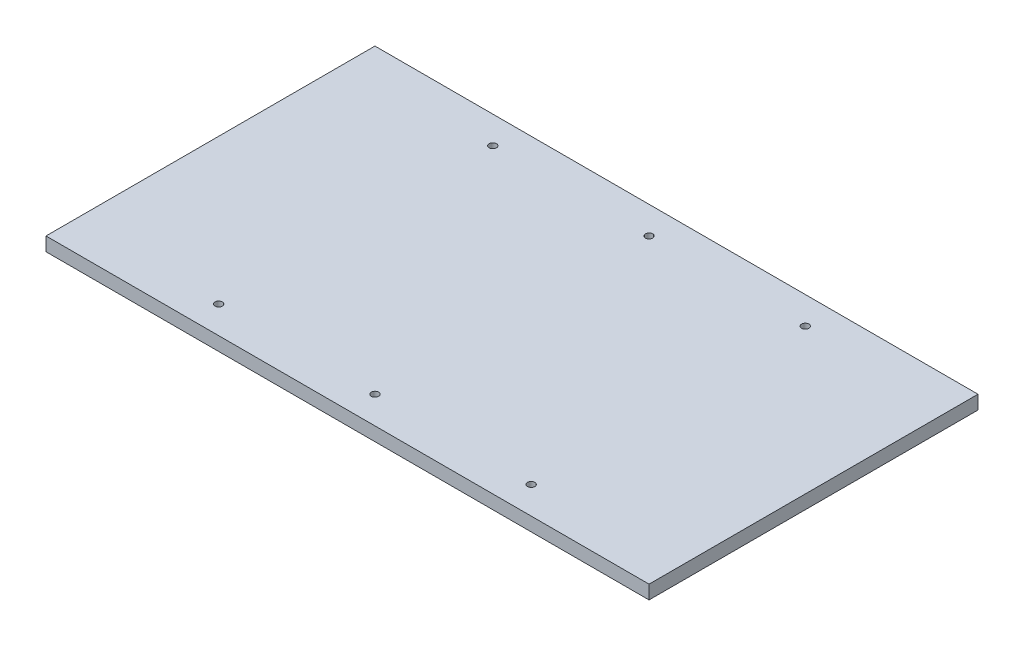
ISO-10303-21;
HEADER;
FILE_DESCRIPTION(('STEP AP214'),'2;1');
FILE_NAME('part.step','',(''),(''),'','','');
FILE_SCHEMA(('AUTOMOTIVE_DESIGN { 1 0 10303 214 1 1 1 1 }'));
ENDSEC;
DATA;
#1=APPLICATION_CONTEXT('core data for automotive mechanical design processes');
#2=APPLICATION_PROTOCOL_DEFINITION('international standard','automotive_design',2000,#1);
#3=PRODUCT_CONTEXT('',#1,'mechanical');
#4=PRODUCT('Part','Part','',(#3));
#5=PRODUCT_RELATED_PRODUCT_CATEGORY('part','',(#4));
#6=PRODUCT_DEFINITION_FORMATION('','',#4);
#7=PRODUCT_DEFINITION_CONTEXT('part definition',#1,'design');
#8=PRODUCT_DEFINITION('design','',#6,#7);
#9=PRODUCT_DEFINITION_SHAPE('','',#8);
#10=(LENGTH_UNIT() NAMED_UNIT(*) SI_UNIT(.MILLI.,.METRE.));
#11=(NAMED_UNIT(*) PLANE_ANGLE_UNIT() SI_UNIT($,.RADIAN.));
#12=(NAMED_UNIT(*) SI_UNIT($,.STERADIAN.) SOLID_ANGLE_UNIT());
#13=UNCERTAINTY_MEASURE_WITH_UNIT(LENGTH_MEASURE(1.E-05),#10,'distance_accuracy_value','');
#14=(GEOMETRIC_REPRESENTATION_CONTEXT(3) GLOBAL_UNCERTAINTY_ASSIGNED_CONTEXT((#13)) GLOBAL_UNIT_ASSIGNED_CONTEXT((#10,
#11,#12)) REPRESENTATION_CONTEXT('',''));
#15=CARTESIAN_POINT('',(0.,0.,0.));
#16=DIRECTION('',(0.,0.,1.));
#17=DIRECTION('',(1.,0.,0.));
#18=AXIS2_PLACEMENT_3D('',#15,#16,#17);
#19=CARTESIAN_POINT('',(0.,6.35,0.));
#20=DIRECTION('',(0.,1.,0.));
#21=DIRECTION('',(0.,0.,1.));
#22=AXIS2_PLACEMENT_3D('',#19,#20,#21);
#23=PLANE('',#22);
#24=CARTESIAN_POINT('',(-2.26979642291372E-13,6.35,63.5));
#25=DIRECTION('',(0.,1.,0.));
#26=DIRECTION('',(0.,0.,-1.));
#27=AXIS2_PLACEMENT_3D('',#24,#25,#26);
#28=CIRCLE('',#27,1.70000000000035);
#29=CARTESIAN_POINT('',(-2.26979642291372E-13,6.35,61.7999999999996));
#30=VERTEX_POINT('',#29);
#31=EDGE_CURVE('E133',#30,#30,#28,.T.);
#32=ORIENTED_EDGE('',*,*,#31,.F.);
#33=EDGE_LOOP('',(#32));
#34=FACE_BOUND('',#33,.T.);
#35=CARTESIAN_POINT('',(-2.26979642291372E-13,6.35,-63.5));
#36=DIRECTION('',(0.,1.,0.));
#37=DIRECTION('',(0.,0.,1.));
#38=AXIS2_PLACEMENT_3D('',#35,#36,#37);
#39=CIRCLE('',#38,1.70000000000035);
#40=CARTESIAN_POINT('',(-2.26979642291372E-13,6.35,-61.7999999999996));
#41=VERTEX_POINT('',#40);
#42=EDGE_CURVE('E121',#41,#41,#39,.T.);
#43=ORIENTED_EDGE('',*,*,#42,.F.);
#44=EDGE_LOOP('',(#43));
#45=FACE_BOUND('',#44,.T.);
#46=CARTESIAN_POINT('',(-72.3899999999993,6.35,-63.5));
#47=DIRECTION('',(0.,1.,0.));
#48=DIRECTION('',(0.,0.,1.));
#49=AXIS2_PLACEMENT_3D('',#46,#47,#48);
#50=CIRCLE('',#49,1.70000000000056);
#51=CARTESIAN_POINT('',(-72.3899999999993,6.35,-61.7999999999994));
#52=VERTEX_POINT('',#51);
#53=EDGE_CURVE('E100',#52,#52,#50,.T.);
#54=ORIENTED_EDGE('',*,*,#53,.F.);
#55=EDGE_LOOP('',(#54));
#56=FACE_BOUND('',#55,.T.);
#57=DIRECTION('',(0.,0.,1.));
#58=VECTOR('',#57,1.);
#59=CARTESIAN_POINT('',(-139.699999999999,6.35,76.2));
#60=LINE('',#59,#58);
#61=CARTESIAN_POINT('',(-139.699999999999,6.35,-76.2));
#62=VERTEX_POINT('',#61);
#63=CARTESIAN_POINT('',(-139.699999999999,6.35,76.2));
#64=VERTEX_POINT('',#63);
#65=EDGE_CURVE('E85',#62,#64,#60,.T.);
#66=ORIENTED_EDGE('',*,*,#65,.T.);
#67=DIRECTION('',(1.,0.,0.));
#68=VECTOR('',#67,1.);
#69=CARTESIAN_POINT('',(139.700000000001,6.35,76.2));
#70=LINE('',#69,#68);
#71=CARTESIAN_POINT('',(139.700000000001,6.35,76.2));
#72=VERTEX_POINT('',#71);
#73=EDGE_CURVE('E80',#64,#72,#70,.T.);
#74=ORIENTED_EDGE('',*,*,#73,.T.);
#75=DIRECTION('',(0.,0.,-1.));
#76=VECTOR('',#75,1.);
#77=CARTESIAN_POINT('',(139.700000000001,6.35,76.2));
#78=LINE('',#77,#76);
#79=CARTESIAN_POINT('',(139.700000000001,6.35,-76.2));
#80=VERTEX_POINT('',#79);
#81=EDGE_CURVE('E83',#72,#80,#78,.T.);
#82=ORIENTED_EDGE('',*,*,#81,.T.);
#83=DIRECTION('',(-1.,0.,0.));
#84=VECTOR('',#83,1.);
#85=CARTESIAN_POINT('',(139.700000000001,6.35,-76.2));
#86=LINE('',#85,#84);
#87=EDGE_CURVE('E50',#80,#62,#86,.T.);
#88=ORIENTED_EDGE('',*,*,#87,.T.);
#89=EDGE_LOOP('',(#66,#74,#82,#88));
#90=FACE_BOUND('',#89,.T.);
#91=CARTESIAN_POINT('',(72.3899999999989,6.35,63.5));
#92=DIRECTION('',(0.,1.,0.));
#93=DIRECTION('',(0.,0.,-1.));
#94=AXIS2_PLACEMENT_3D('',#91,#92,#93);
#95=CIRCLE('',#94,1.70000000000034);
#96=CARTESIAN_POINT('',(72.3899999999989,6.35,61.7999999999997));
#97=VERTEX_POINT('',#96);
#98=EDGE_CURVE('E115',#97,#97,#95,.T.);
#99=ORIENTED_EDGE('',*,*,#98,.F.);
#100=EDGE_LOOP('',(#99));
#101=FACE_BOUND('',#100,.T.);
#102=CARTESIAN_POINT('',(72.3899999999989,6.35,-63.5));
#103=DIRECTION('',(0.,1.,0.));
#104=DIRECTION('',(0.,0.,1.));
#105=AXIS2_PLACEMENT_3D('',#102,#103,#104);
#106=CIRCLE('',#105,1.70000000000034);
#107=CARTESIAN_POINT('',(72.3899999999989,6.35,-61.7999999999997));
#108=VERTEX_POINT('',#107);
#109=EDGE_CURVE('E127',#108,#108,#106,.T.);
#110=ORIENTED_EDGE('',*,*,#109,.F.);
#111=EDGE_LOOP('',(#110));
#112=FACE_BOUND('',#111,.T.);
#113=CARTESIAN_POINT('',(-72.3899999999993,6.35,63.5));
#114=DIRECTION('',(0.,1.,0.));
#115=DIRECTION('',(0.,0.,-1.));
#116=AXIS2_PLACEMENT_3D('',#113,#114,#115);
#117=CIRCLE('',#116,1.70000000000056);
#118=CARTESIAN_POINT('',(-72.3899999999993,6.35,61.7999999999994));
#119=VERTEX_POINT('',#118);
#120=EDGE_CURVE('E139',#119,#119,#117,.T.);
#121=ORIENTED_EDGE('',*,*,#120,.F.);
#122=EDGE_LOOP('',(#121));
#123=FACE_BOUND('',#122,.T.);
#124=ADVANCED_FACE('F33',(#34,#45,#56,#90,#101,#112,#123),#23,.T.);
#125=CARTESIAN_POINT('',(0.,0.,0.));
#126=DIRECTION('',(0.,1.,0.));
#127=DIRECTION('',(0.,0.,1.));
#128=AXIS2_PLACEMENT_3D('',#125,#126,#127);
#129=PLANE('',#128);
#130=CARTESIAN_POINT('',(-2.26979642291372E-13,0.,63.5));
#131=DIRECTION('',(0.,1.,0.));
#132=DIRECTION('',(0.,0.,-1.));
#133=AXIS2_PLACEMENT_3D('',#130,#131,#132);
#134=CIRCLE('',#133,1.70000000000035);
#135=CARTESIAN_POINT('',(-2.26979642291372E-13,0.,61.7999999999996));
#136=VERTEX_POINT('',#135);
#137=EDGE_CURVE('E136',#136,#136,#134,.T.);
#138=ORIENTED_EDGE('',*,*,#137,.T.);
#139=EDGE_LOOP('',(#138));
#140=FACE_BOUND('',#139,.T.);
#141=CARTESIAN_POINT('',(-2.26979642291372E-13,0.,-63.5));
#142=DIRECTION('',(0.,1.,0.));
#143=DIRECTION('',(0.,0.,1.));
#144=AXIS2_PLACEMENT_3D('',#141,#142,#143);
#145=CIRCLE('',#144,1.70000000000035);
#146=CARTESIAN_POINT('',(-2.26979642291372E-13,0.,-61.7999999999996));
#147=VERTEX_POINT('',#146);
#148=EDGE_CURVE('E124',#147,#147,#145,.T.);
#149=ORIENTED_EDGE('',*,*,#148,.T.);
#150=EDGE_LOOP('',(#149));
#151=FACE_BOUND('',#150,.T.);
#152=CARTESIAN_POINT('',(-72.3899999999993,0.,-63.5));
#153=DIRECTION('',(0.,1.,0.));
#154=DIRECTION('',(0.,0.,1.));
#155=AXIS2_PLACEMENT_3D('',#152,#153,#154);
#156=CIRCLE('',#155,1.70000000000056);
#157=CARTESIAN_POINT('',(-72.3899999999993,0.,-61.7999999999994));
#158=VERTEX_POINT('',#157);
#159=EDGE_CURVE('E112',#158,#158,#156,.T.);
#160=ORIENTED_EDGE('',*,*,#159,.T.);
#161=EDGE_LOOP('',(#160));
#162=FACE_BOUND('',#161,.T.);
#163=DIRECTION('',(0.,0.,1.));
#164=VECTOR('',#163,1.);
#165=CARTESIAN_POINT('',(-139.699999999999,0.,76.2));
#166=LINE('',#165,#164);
#167=CARTESIAN_POINT('',(-139.699999999999,0.,-76.2));
#168=VERTEX_POINT('',#167);
#169=CARTESIAN_POINT('',(-139.699999999999,0.,76.2));
#170=VERTEX_POINT('',#169);
#171=EDGE_CURVE('E97',#168,#170,#166,.T.);
#172=ORIENTED_EDGE('',*,*,#171,.F.);
#173=DIRECTION('',(-1.,0.,0.));
#174=VECTOR('',#173,1.);
#175=CARTESIAN_POINT('',(139.700000000001,0.,-76.2));
#176=LINE('',#175,#174);
#177=CARTESIAN_POINT('',(139.700000000001,0.,-76.2));
#178=VERTEX_POINT('',#177);
#179=EDGE_CURVE('E73',#178,#168,#176,.T.);
#180=ORIENTED_EDGE('',*,*,#179,.F.);
#181=DIRECTION('',(0.,0.,-1.));
#182=VECTOR('',#181,1.);
#183=CARTESIAN_POINT('',(139.700000000001,0.,76.2));
#184=LINE('',#183,#182);
#185=CARTESIAN_POINT('',(139.700000000001,0.,76.2));
#186=VERTEX_POINT('',#185);
#187=EDGE_CURVE('E67',#186,#178,#184,.T.);
#188=ORIENTED_EDGE('',*,*,#187,.F.);
#189=DIRECTION('',(1.,0.,0.));
#190=VECTOR('',#189,1.);
#191=CARTESIAN_POINT('',(139.700000000001,0.,76.2));
#192=LINE('',#191,#190);
#193=EDGE_CURVE('E89',#170,#186,#192,.T.);
#194=ORIENTED_EDGE('',*,*,#193,.F.);
#195=EDGE_LOOP('',(#172,#180,#188,#194));
#196=FACE_BOUND('',#195,.T.);
#197=CARTESIAN_POINT('',(72.3899999999989,0.,63.5));
#198=DIRECTION('',(0.,1.,0.));
#199=DIRECTION('',(0.,0.,-1.));
#200=AXIS2_PLACEMENT_3D('',#197,#198,#199);
#201=CIRCLE('',#200,1.70000000000034);
#202=CARTESIAN_POINT('',(72.3899999999989,0.,61.7999999999997));
#203=VERTEX_POINT('',#202);
#204=EDGE_CURVE('E118',#203,#203,#201,.T.);
#205=ORIENTED_EDGE('',*,*,#204,.T.);
#206=EDGE_LOOP('',(#205));
#207=FACE_BOUND('',#206,.T.);
#208=CARTESIAN_POINT('',(72.3899999999989,0.,-63.5));
#209=DIRECTION('',(0.,1.,0.));
#210=DIRECTION('',(0.,0.,1.));
#211=AXIS2_PLACEMENT_3D('',#208,#209,#210);
#212=CIRCLE('',#211,1.70000000000034);
#213=CARTESIAN_POINT('',(72.3899999999989,0.,-61.7999999999997));
#214=VERTEX_POINT('',#213);
#215=EDGE_CURVE('E130',#214,#214,#212,.T.);
#216=ORIENTED_EDGE('',*,*,#215,.T.);
#217=EDGE_LOOP('',(#216));
#218=FACE_BOUND('',#217,.T.);
#219=CARTESIAN_POINT('',(-72.3899999999993,0.,63.5));
#220=DIRECTION('',(0.,1.,0.));
#221=DIRECTION('',(0.,0.,-1.));
#222=AXIS2_PLACEMENT_3D('',#219,#220,#221);
#223=CIRCLE('',#222,1.70000000000056);
#224=CARTESIAN_POINT('',(-72.3899999999993,0.,61.7999999999994));
#225=VERTEX_POINT('',#224);
#226=EDGE_CURVE('E142',#225,#225,#223,.T.);
#227=ORIENTED_EDGE('',*,*,#226,.T.);
#228=EDGE_LOOP('',(#227));
#229=FACE_BOUND('',#228,.T.);
#230=ADVANCED_FACE('F108',(#140,#151,#162,#196,#207,#218,#229),#129,.F.);
#231=CARTESIAN_POINT('',(-139.699999999999,6.35,76.2));
#232=DIRECTION('',(1.,0.,0.));
#233=DIRECTION('',(0.,0.,-1.));
#234=AXIS2_PLACEMENT_3D('',#231,#232,#233);
#235=PLANE('',#234);
#236=ORIENTED_EDGE('',*,*,#171,.T.);
#237=DIRECTION('',(0.,-1.,0.));
#238=VECTOR('',#237,1.);
#239=CARTESIAN_POINT('',(-139.699999999999,6.35,76.2));
#240=LINE('',#239,#238);
#241=EDGE_CURVE('E11',#64,#170,#240,.T.);
#242=ORIENTED_EDGE('',*,*,#241,.F.);
#243=ORIENTED_EDGE('',*,*,#65,.F.);
#244=DIRECTION('',(0.,-1.,0.));
#245=VECTOR('',#244,1.);
#246=CARTESIAN_POINT('',(-139.699999999999,6.35,-76.2));
#247=LINE('',#246,#245);
#248=EDGE_CURVE('E93',#62,#168,#247,.T.);
#249=ORIENTED_EDGE('',*,*,#248,.T.);
#250=EDGE_LOOP('',(#236,#242,#243,#249));
#251=FACE_BOUND('',#250,.T.);
#252=ADVANCED_FACE('F35',(#251),#235,.F.);
#253=CARTESIAN_POINT('',(139.700000000001,6.35,76.2));
#254=DIRECTION('',(0.,0.,-1.));
#255=DIRECTION('',(-1.,0.,0.));
#256=AXIS2_PLACEMENT_3D('',#253,#254,#255);
#257=PLANE('',#256);
#258=ORIENTED_EDGE('',*,*,#193,.T.);
#259=DIRECTION('',(0.,-1.,0.));
#260=VECTOR('',#259,1.);
#261=CARTESIAN_POINT('',(139.700000000001,6.35,76.2));
#262=LINE('',#261,#260);
#263=EDGE_CURVE('E42',#72,#186,#262,.T.);
#264=ORIENTED_EDGE('',*,*,#263,.F.);
#265=ORIENTED_EDGE('',*,*,#73,.F.);
#266=ORIENTED_EDGE('',*,*,#241,.T.);
#267=EDGE_LOOP('',(#258,#264,#265,#266));
#268=FACE_BOUND('',#267,.T.);
#269=ADVANCED_FACE('F88',(#268),#257,.F.);
#270=CARTESIAN_POINT('',(139.700000000001,6.35,76.2));
#271=DIRECTION('',(-1.,0.,0.));
#272=DIRECTION('',(0.,0.,1.));
#273=AXIS2_PLACEMENT_3D('',#270,#271,#272);
#274=PLANE('',#273);
#275=ORIENTED_EDGE('',*,*,#187,.T.);
#276=DIRECTION('',(0.,-1.,0.));
#277=VECTOR('',#276,1.);
#278=CARTESIAN_POINT('',(139.700000000001,6.35,-76.2));
#279=LINE('',#278,#277);
#280=EDGE_CURVE('E90',#80,#178,#279,.T.);
#281=ORIENTED_EDGE('',*,*,#280,.F.);
#282=ORIENTED_EDGE('',*,*,#81,.F.);
#283=ORIENTED_EDGE('',*,*,#263,.T.);
#284=EDGE_LOOP('',(#275,#281,#282,#283));
#285=FACE_BOUND('',#284,.T.);
#286=ADVANCED_FACE('F91',(#285),#274,.F.);
#287=CARTESIAN_POINT('',(139.700000000001,6.35,-76.2));
#288=DIRECTION('',(0.,0.,1.));
#289=DIRECTION('',(1.,0.,0.));
#290=AXIS2_PLACEMENT_3D('',#287,#288,#289);
#291=PLANE('',#290);
#292=ORIENTED_EDGE('',*,*,#179,.T.);
#293=ORIENTED_EDGE('',*,*,#248,.F.);
#294=ORIENTED_EDGE('',*,*,#87,.F.);
#295=ORIENTED_EDGE('',*,*,#280,.T.);
#296=EDGE_LOOP('',(#292,#293,#294,#295));
#297=FACE_BOUND('',#296,.T.);
#298=ADVANCED_FACE('F105',(#297),#291,.F.);
#299=CARTESIAN_POINT('',(-72.3899999999993,6.35,-63.5));
#300=DIRECTION('',(0.,-1.,0.));
#301=DIRECTION('',(0.,0.,-1.));
#302=AXIS2_PLACEMENT_3D('',#299,#300,#301);
#303=CYLINDRICAL_SURFACE('',#302,1.70000000000056);
#304=ORIENTED_EDGE('',*,*,#53,.T.);
#305=EDGE_LOOP('',(#304));
#306=FACE_BOUND('',#305,.T.);
#307=ORIENTED_EDGE('',*,*,#159,.F.);
#308=EDGE_LOOP('',(#307));
#309=FACE_BOUND('',#308,.T.);
#310=ADVANCED_FACE('F162',(#306,#309),#303,.F.);
#311=CARTESIAN_POINT('',(72.3899999999989,6.35,63.5));
#312=DIRECTION('',(0.,-1.,0.));
#313=DIRECTION('',(0.,0.,-1.));
#314=AXIS2_PLACEMENT_3D('',#311,#312,#313);
#315=CYLINDRICAL_SURFACE('',#314,1.70000000000034);
#316=ORIENTED_EDGE('',*,*,#98,.T.);
#317=EDGE_LOOP('',(#316));
#318=FACE_BOUND('',#317,.T.);
#319=ORIENTED_EDGE('',*,*,#204,.F.);
#320=EDGE_LOOP('',(#319));
#321=FACE_BOUND('',#320,.T.);
#322=ADVANCED_FACE('F208',(#318,#321),#315,.F.);
#323=CARTESIAN_POINT('',(-2.26979642291372E-13,6.35,-63.5));
#324=DIRECTION('',(0.,-1.,0.));
#325=DIRECTION('',(0.,0.,-1.));
#326=AXIS2_PLACEMENT_3D('',#323,#324,#325);
#327=CYLINDRICAL_SURFACE('',#326,1.70000000000035);
#328=ORIENTED_EDGE('',*,*,#42,.T.);
#329=EDGE_LOOP('',(#328));
#330=FACE_BOUND('',#329,.T.);
#331=ORIENTED_EDGE('',*,*,#148,.F.);
#332=EDGE_LOOP('',(#331));
#333=FACE_BOUND('',#332,.T.);
#334=ADVANCED_FACE('F216',(#330,#333),#327,.F.);
#335=CARTESIAN_POINT('',(72.3899999999989,6.35,-63.5));
#336=DIRECTION('',(0.,-1.,0.));
#337=DIRECTION('',(0.,0.,-1.));
#338=AXIS2_PLACEMENT_3D('',#335,#336,#337);
#339=CYLINDRICAL_SURFACE('',#338,1.70000000000034);
#340=ORIENTED_EDGE('',*,*,#109,.T.);
#341=EDGE_LOOP('',(#340));
#342=FACE_BOUND('',#341,.T.);
#343=ORIENTED_EDGE('',*,*,#215,.F.);
#344=EDGE_LOOP('',(#343));
#345=FACE_BOUND('',#344,.T.);
#346=ADVANCED_FACE('F224',(#342,#345),#339,.F.);
#347=CARTESIAN_POINT('',(-2.26979642291372E-13,6.35,63.5));
#348=DIRECTION('',(0.,-1.,0.));
#349=DIRECTION('',(0.,0.,-1.));
#350=AXIS2_PLACEMENT_3D('',#347,#348,#349);
#351=CYLINDRICAL_SURFACE('',#350,1.70000000000035);
#352=ORIENTED_EDGE('',*,*,#31,.T.);
#353=EDGE_LOOP('',(#352));
#354=FACE_BOUND('',#353,.T.);
#355=ORIENTED_EDGE('',*,*,#137,.F.);
#356=EDGE_LOOP('',(#355));
#357=FACE_BOUND('',#356,.T.);
#358=ADVANCED_FACE('F233',(#354,#357),#351,.F.);
#359=CARTESIAN_POINT('',(-72.3899999999993,6.35,63.5));
#360=DIRECTION('',(0.,-1.,0.));
#361=DIRECTION('',(0.,0.,-1.));
#362=AXIS2_PLACEMENT_3D('',#359,#360,#361);
#363=CYLINDRICAL_SURFACE('',#362,1.70000000000056);
#364=ORIENTED_EDGE('',*,*,#120,.T.);
#365=EDGE_LOOP('',(#364));
#366=FACE_BOUND('',#365,.T.);
#367=ORIENTED_EDGE('',*,*,#226,.F.);
#368=EDGE_LOOP('',(#367));
#369=FACE_BOUND('',#368,.T.);
#370=ADVANCED_FACE('F148',(#366,#369),#363,.F.);
#371=CLOSED_SHELL('',(#124,#230,#252,#269,#286,#298,#310,#322,#334,#346,#358,#370));
#372=MANIFOLD_SOLID_BREP('B2',#371);
#373=ADVANCED_BREP_SHAPE_REPRESENTATION('',(#18,#372),#14);
#374=SHAPE_DEFINITION_REPRESENTATION(#9,#373);
ENDSEC;
END-ISO-10303-21;
